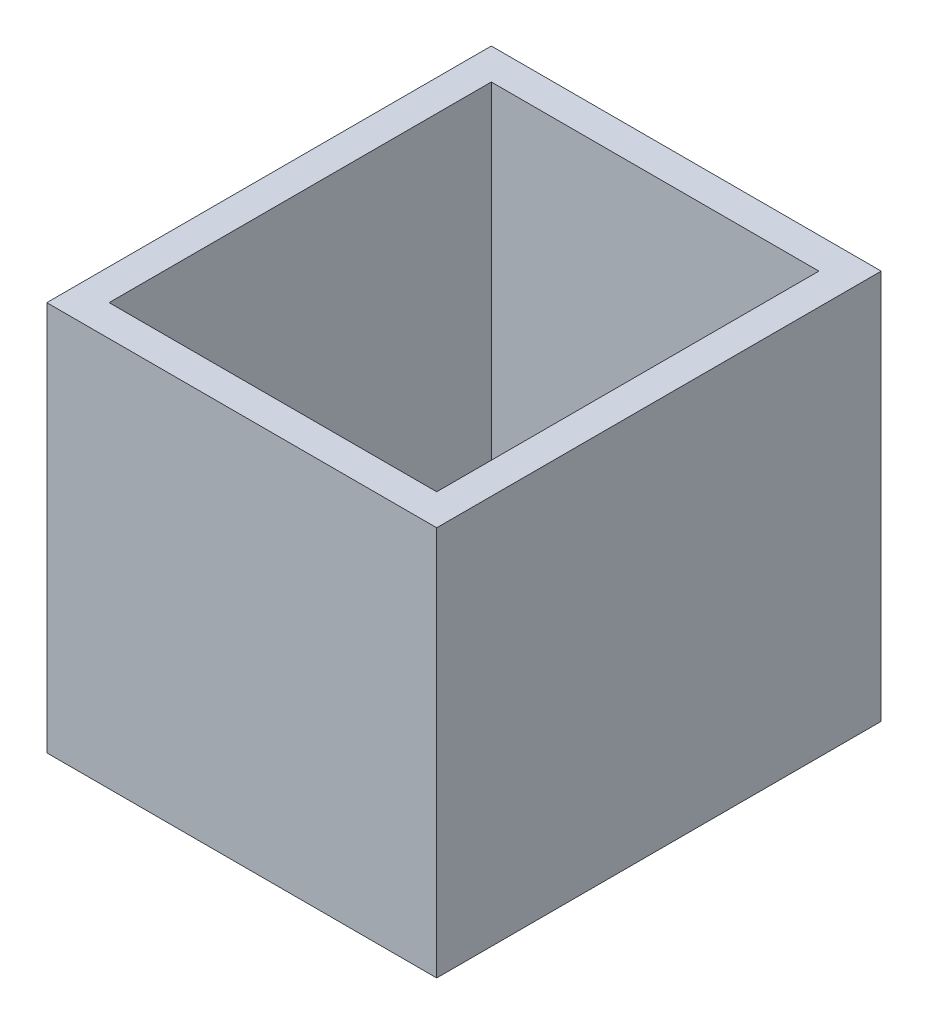
ISO-10303-21;
HEADER;
FILE_DESCRIPTION(('STEP AP214'),'2;1');
FILE_NAME('part.step','',(''),(''),'','','');
FILE_SCHEMA(('AUTOMOTIVE_DESIGN { 1 0 10303 214 1 1 1 1 }'));
ENDSEC;
DATA;
#1=APPLICATION_CONTEXT('core data for automotive mechanical design processes');
#2=APPLICATION_PROTOCOL_DEFINITION('international standard','automotive_design',2000,#1);
#3=PRODUCT_CONTEXT('',#1,'mechanical');
#4=PRODUCT('Part','Part','',(#3));
#5=PRODUCT_RELATED_PRODUCT_CATEGORY('part','',(#4));
#6=PRODUCT_DEFINITION_FORMATION('','',#4);
#7=PRODUCT_DEFINITION_CONTEXT('part definition',#1,'design');
#8=PRODUCT_DEFINITION('design','',#6,#7);
#9=PRODUCT_DEFINITION_SHAPE('','',#8);
#10=(LENGTH_UNIT() NAMED_UNIT(*) SI_UNIT(.MILLI.,.METRE.));
#11=(NAMED_UNIT(*) PLANE_ANGLE_UNIT() SI_UNIT($,.RADIAN.));
#12=(NAMED_UNIT(*) SI_UNIT($,.STERADIAN.) SOLID_ANGLE_UNIT());
#13=UNCERTAINTY_MEASURE_WITH_UNIT(LENGTH_MEASURE(1.E-05),#10,'distance_accuracy_value','');
#14=(GEOMETRIC_REPRESENTATION_CONTEXT(3) GLOBAL_UNCERTAINTY_ASSIGNED_CONTEXT((#13)) GLOBAL_UNIT_ASSIGNED_CONTEXT((#10,
#11,#12)) REPRESENTATION_CONTEXT('',''));
#15=CARTESIAN_POINT('',(0.,0.,0.));
#16=DIRECTION('',(0.,0.,1.));
#17=DIRECTION('',(1.,0.,0.));
#18=AXIS2_PLACEMENT_3D('',#15,#16,#17);
#19=CARTESIAN_POINT('',(0.,80.,0.));
#20=DIRECTION('',(0.,1.,0.));
#21=DIRECTION('',(0.,0.,1.));
#22=AXIS2_PLACEMENT_3D('',#19,#20,#21);
#23=PLANE('',#22);
#24=DIRECTION('',(-1.,0.,0.));
#25=VECTOR('',#24,1.);
#26=CARTESIAN_POINT('',(-105.,80.,-49.01));
#27=LINE('',#26,#25);
#28=CARTESIAN_POINT('',(12.01,80.,-49.01));
#29=VERTEX_POINT('',#28);
#30=CARTESIAN_POINT('',(-72.01,80.,-49.01));
#31=VERTEX_POINT('',#30);
#32=EDGE_CURVE('E49',#29,#31,#27,.T.);
#33=ORIENTED_EDGE('',*,*,#32,.T.);
#34=DIRECTION('',(0.,0.,-1.));
#35=VECTOR('',#34,1.);
#36=CARTESIAN_POINT('',(-72.01,80.,105.));
#37=LINE('',#36,#35);
#38=CARTESIAN_POINT('',(-72.01,80.,49.01));
#39=VERTEX_POINT('',#38);
#40=EDGE_CURVE('E137',#39,#31,#37,.T.);
#41=ORIENTED_EDGE('',*,*,#40,.F.);
#42=DIRECTION('',(1.,0.,0.));
#43=VECTOR('',#42,1.);
#44=CARTESIAN_POINT('',(-105.,80.,49.01));
#45=LINE('',#44,#43);
#46=CARTESIAN_POINT('',(12.01,80.,49.01));
#47=VERTEX_POINT('',#46);
#48=EDGE_CURVE('E11',#39,#47,#45,.T.);
#49=ORIENTED_EDGE('',*,*,#48,.T.);
#50=DIRECTION('',(0.,0.,-1.));
#51=VECTOR('',#50,1.);
#52=CARTESIAN_POINT('',(12.01,80.,105.));
#53=LINE('',#52,#51);
#54=EDGE_CURVE('E63',#47,#29,#53,.T.);
#55=ORIENTED_EDGE('',*,*,#54,.T.);
#56=EDGE_LOOP('',(#33,#41,#49,#55));
#57=FACE_BOUND('',#56,.T.);
#58=DIRECTION('',(0.,0.,-1.));
#59=VECTOR('',#58,1.);
#60=CARTESIAN_POINT('',(20.,80.,105.));
#61=LINE('',#60,#59);
#62=CARTESIAN_POINT('',(20.,80.,57.));
#63=VERTEX_POINT('',#62);
#64=CARTESIAN_POINT('',(20.,80.,-57.));
#65=VERTEX_POINT('',#64);
#66=EDGE_CURVE('E144',#63,#65,#61,.T.);
#67=ORIENTED_EDGE('',*,*,#66,.F.);
#68=DIRECTION('',(1.,0.,0.));
#69=VECTOR('',#68,1.);
#70=CARTESIAN_POINT('',(-105.,80.,57.));
#71=LINE('',#70,#69);
#72=CARTESIAN_POINT('',(-80.,80.,57.));
#73=VERTEX_POINT('',#72);
#74=EDGE_CURVE('E139',#73,#63,#71,.T.);
#75=ORIENTED_EDGE('',*,*,#74,.F.);
#76=DIRECTION('',(0.,0.,-1.));
#77=VECTOR('',#76,1.);
#78=CARTESIAN_POINT('',(-80.,80.,105.));
#79=LINE('',#78,#77);
#80=CARTESIAN_POINT('',(-80.,80.,-57.));
#81=VERTEX_POINT('',#80);
#82=EDGE_CURVE('E148',#73,#81,#79,.T.);
#83=ORIENTED_EDGE('',*,*,#82,.T.);
#84=DIRECTION('',(-1.,0.,0.));
#85=VECTOR('',#84,1.);
#86=CARTESIAN_POINT('',(-105.,80.,-57.));
#87=LINE('',#86,#85);
#88=EDGE_CURVE('E143',#65,#81,#87,.T.);
#89=ORIENTED_EDGE('',*,*,#88,.F.);
#90=EDGE_LOOP('',(#67,#75,#83,#89));
#91=FACE_BOUND('',#90,.T.);
#92=ADVANCED_FACE('F41',(#57,#91),#23,.F.);
#93=CARTESIAN_POINT('',(0.,180.,0.));
#94=DIRECTION('',(0.,1.,0.));
#95=DIRECTION('',(0.,0.,1.));
#96=AXIS2_PLACEMENT_3D('',#93,#94,#95);
#97=PLANE('',#96);
#98=DIRECTION('',(0.,0.,-1.));
#99=VECTOR('',#98,1.);
#100=CARTESIAN_POINT('',(20.,180.,105.));
#101=LINE('',#100,#99);
#102=CARTESIAN_POINT('',(20.,180.,57.));
#103=VERTEX_POINT('',#102);
#104=CARTESIAN_POINT('',(20.,180.,-57.));
#105=VERTEX_POINT('',#104);
#106=EDGE_CURVE('E151',#103,#105,#101,.T.);
#107=ORIENTED_EDGE('',*,*,#106,.T.);
#108=DIRECTION('',(-1.,0.,0.));
#109=VECTOR('',#108,1.);
#110=CARTESIAN_POINT('',(-105.,180.,-57.));
#111=LINE('',#110,#109);
#112=CARTESIAN_POINT('',(-80.,180.,-57.));
#113=VERTEX_POINT('',#112);
#114=EDGE_CURVE('E44',#105,#113,#111,.T.);
#115=ORIENTED_EDGE('',*,*,#114,.T.);
#116=DIRECTION('',(0.,0.,-1.));
#117=VECTOR('',#116,1.);
#118=CARTESIAN_POINT('',(-80.,180.,105.));
#119=LINE('',#118,#117);
#120=CARTESIAN_POINT('',(-80.,180.,57.));
#121=VERTEX_POINT('',#120);
#122=EDGE_CURVE('E147',#121,#113,#119,.T.);
#123=ORIENTED_EDGE('',*,*,#122,.F.);
#124=DIRECTION('',(1.,0.,0.));
#125=VECTOR('',#124,1.);
#126=CARTESIAN_POINT('',(-105.,180.,57.));
#127=LINE('',#126,#125);
#128=EDGE_CURVE('E122',#121,#103,#127,.T.);
#129=ORIENTED_EDGE('',*,*,#128,.T.);
#130=EDGE_LOOP('',(#107,#115,#123,#129));
#131=FACE_BOUND('',#130,.T.);
#132=DIRECTION('',(-1.,0.,0.));
#133=VECTOR('',#132,1.);
#134=CARTESIAN_POINT('',(-105.,180.,-49.01));
#135=LINE('',#134,#133);
#136=CARTESIAN_POINT('',(12.01,180.,-49.01));
#137=VERTEX_POINT('',#136);
#138=CARTESIAN_POINT('',(-72.01,180.,-49.01));
#139=VERTEX_POINT('',#138);
#140=EDGE_CURVE('E114',#137,#139,#135,.T.);
#141=ORIENTED_EDGE('',*,*,#140,.F.);
#142=DIRECTION('',(0.,0.,-1.));
#143=VECTOR('',#142,1.);
#144=CARTESIAN_POINT('',(12.01,180.,105.));
#145=LINE('',#144,#143);
#146=CARTESIAN_POINT('',(12.01,180.,49.01));
#147=VERTEX_POINT('',#146);
#148=EDGE_CURVE('E113',#147,#137,#145,.T.);
#149=ORIENTED_EDGE('',*,*,#148,.F.);
#150=DIRECTION('',(1.,0.,0.));
#151=VECTOR('',#150,1.);
#152=CARTESIAN_POINT('',(-105.,180.,49.01));
#153=LINE('',#152,#151);
#154=CARTESIAN_POINT('',(-72.01,180.,49.01));
#155=VERTEX_POINT('',#154);
#156=EDGE_CURVE('E107',#155,#147,#153,.T.);
#157=ORIENTED_EDGE('',*,*,#156,.F.);
#158=DIRECTION('',(0.,0.,-1.));
#159=VECTOR('',#158,1.);
#160=CARTESIAN_POINT('',(-72.01,180.,105.));
#161=LINE('',#160,#159);
#162=EDGE_CURVE('E110',#155,#139,#161,.T.);
#163=ORIENTED_EDGE('',*,*,#162,.T.);
#164=EDGE_LOOP('',(#141,#149,#157,#163));
#165=FACE_BOUND('',#164,.T.);
#166=ADVANCED_FACE('F109',(#131,#165),#97,.T.);
#167=CARTESIAN_POINT('',(-72.01,0.,105.));
#168=DIRECTION('',(-1.,0.,0.));
#169=DIRECTION('',(0.,0.,1.));
#170=AXIS2_PLACEMENT_3D('',#167,#168,#169);
#171=PLANE('',#170);
#172=ORIENTED_EDGE('',*,*,#162,.F.);
#173=DIRECTION('',(0.,-1.,0.));
#174=VECTOR('',#173,1.);
#175=CARTESIAN_POINT('',(-72.01,0.,49.01));
#176=LINE('',#175,#174);
#177=EDGE_CURVE('E115',#155,#39,#176,.T.);
#178=ORIENTED_EDGE('',*,*,#177,.T.);
#179=ORIENTED_EDGE('',*,*,#40,.T.);
#180=DIRECTION('',(0.,1.,0.));
#181=VECTOR('',#180,1.);
#182=CARTESIAN_POINT('',(-72.01,0.,-49.01));
#183=LINE('',#182,#181);
#184=EDGE_CURVE('E121',#31,#139,#183,.T.);
#185=ORIENTED_EDGE('',*,*,#184,.T.);
#186=EDGE_LOOP('',(#172,#178,#179,#185));
#187=FACE_BOUND('',#186,.T.);
#188=ADVANCED_FACE('F119',(#187),#171,.F.);
#189=CARTESIAN_POINT('',(12.01,0.,105.));
#190=DIRECTION('',(-1.,0.,0.));
#191=DIRECTION('',(0.,0.,1.));
#192=AXIS2_PLACEMENT_3D('',#189,#190,#191);
#193=PLANE('',#192);
#194=DIRECTION('',(0.,-1.,0.));
#195=VECTOR('',#194,1.);
#196=CARTESIAN_POINT('',(12.01,0.,49.01));
#197=LINE('',#196,#195);
#198=EDGE_CURVE('E134',#147,#47,#197,.T.);
#199=ORIENTED_EDGE('',*,*,#198,.F.);
#200=ORIENTED_EDGE('',*,*,#148,.T.);
#201=DIRECTION('',(0.,1.,0.));
#202=VECTOR('',#201,1.);
#203=CARTESIAN_POINT('',(12.01,0.,-49.01));
#204=LINE('',#203,#202);
#205=EDGE_CURVE('E126',#29,#137,#204,.T.);
#206=ORIENTED_EDGE('',*,*,#205,.F.);
#207=ORIENTED_EDGE('',*,*,#54,.F.);
#208=EDGE_LOOP('',(#199,#200,#206,#207));
#209=FACE_BOUND('',#208,.T.);
#210=ADVANCED_FACE('F193',(#209),#193,.T.);
#211=CARTESIAN_POINT('',(-105.,207.,-49.01));
#212=DIRECTION('',(0.,0.,1.));
#213=DIRECTION('',(0.,-1.,0.));
#214=AXIS2_PLACEMENT_3D('',#211,#212,#213);
#215=PLANE('',#214);
#216=ORIENTED_EDGE('',*,*,#205,.T.);
#217=ORIENTED_EDGE('',*,*,#140,.T.);
#218=ORIENTED_EDGE('',*,*,#184,.F.);
#219=ORIENTED_EDGE('',*,*,#32,.F.);
#220=EDGE_LOOP('',(#216,#217,#218,#219));
#221=FACE_BOUND('',#220,.T.);
#222=ADVANCED_FACE('F192',(#221),#215,.T.);
#223=CARTESIAN_POINT('',(-105.,207.,49.01));
#224=DIRECTION('',(0.,0.,-1.));
#225=DIRECTION('',(0.,1.,0.));
#226=AXIS2_PLACEMENT_3D('',#223,#224,#225);
#227=PLANE('',#226);
#228=ORIENTED_EDGE('',*,*,#177,.F.);
#229=ORIENTED_EDGE('',*,*,#156,.T.);
#230=ORIENTED_EDGE('',*,*,#198,.T.);
#231=ORIENTED_EDGE('',*,*,#48,.F.);
#232=EDGE_LOOP('',(#228,#229,#230,#231));
#233=FACE_BOUND('',#232,.T.);
#234=ADVANCED_FACE('F124',(#233),#227,.T.);
#235=CARTESIAN_POINT('',(20.,0.,105.));
#236=DIRECTION('',(-1.,0.,0.));
#237=DIRECTION('',(0.,0.,1.));
#238=AXIS2_PLACEMENT_3D('',#235,#236,#237);
#239=PLANE('',#238);
#240=ORIENTED_EDGE('',*,*,#106,.F.);
#241=DIRECTION('',(0.,-1.,0.));
#242=VECTOR('',#241,1.);
#243=CARTESIAN_POINT('',(20.,0.,57.));
#244=LINE('',#243,#242);
#245=EDGE_CURVE('E129',#103,#63,#244,.T.);
#246=ORIENTED_EDGE('',*,*,#245,.T.);
#247=ORIENTED_EDGE('',*,*,#66,.T.);
#248=DIRECTION('',(0.,1.,0.));
#249=VECTOR('',#248,1.);
#250=CARTESIAN_POINT('',(20.,0.,-57.));
#251=LINE('',#250,#249);
#252=EDGE_CURVE('E174',#65,#105,#251,.T.);
#253=ORIENTED_EDGE('',*,*,#252,.T.);
#254=EDGE_LOOP('',(#240,#246,#247,#253));
#255=FACE_BOUND('',#254,.T.);
#256=ADVANCED_FACE('F179',(#255),#239,.F.);
#257=CARTESIAN_POINT('',(-80.,0.,105.));
#258=DIRECTION('',(-1.,0.,0.));
#259=DIRECTION('',(0.,0.,1.));
#260=AXIS2_PLACEMENT_3D('',#257,#258,#259);
#261=PLANE('',#260);
#262=DIRECTION('',(0.,-1.,0.));
#263=VECTOR('',#262,1.);
#264=CARTESIAN_POINT('',(-80.,0.,57.));
#265=LINE('',#264,#263);
#266=EDGE_CURVE('E166',#121,#73,#265,.T.);
#267=ORIENTED_EDGE('',*,*,#266,.F.);
#268=ORIENTED_EDGE('',*,*,#122,.T.);
#269=DIRECTION('',(0.,1.,0.));
#270=VECTOR('',#269,1.);
#271=CARTESIAN_POINT('',(-80.,0.,-57.));
#272=LINE('',#271,#270);
#273=EDGE_CURVE('E164',#81,#113,#272,.T.);
#274=ORIENTED_EDGE('',*,*,#273,.F.);
#275=ORIENTED_EDGE('',*,*,#82,.F.);
#276=EDGE_LOOP('',(#267,#268,#274,#275));
#277=FACE_BOUND('',#276,.T.);
#278=ADVANCED_FACE('F163',(#277),#261,.T.);
#279=CARTESIAN_POINT('',(-105.,207.,57.));
#280=DIRECTION('',(0.,0.,-1.));
#281=DIRECTION('',(0.,1.,0.));
#282=AXIS2_PLACEMENT_3D('',#279,#280,#281);
#283=PLANE('',#282);
#284=ORIENTED_EDGE('',*,*,#128,.F.);
#285=ORIENTED_EDGE('',*,*,#266,.T.);
#286=ORIENTED_EDGE('',*,*,#74,.T.);
#287=ORIENTED_EDGE('',*,*,#245,.F.);
#288=EDGE_LOOP('',(#284,#285,#286,#287));
#289=FACE_BOUND('',#288,.T.);
#290=ADVANCED_FACE('F182',(#289),#283,.F.);
#291=CARTESIAN_POINT('',(-105.,207.,-57.));
#292=DIRECTION('',(0.,0.,1.));
#293=DIRECTION('',(0.,-1.,0.));
#294=AXIS2_PLACEMENT_3D('',#291,#292,#293);
#295=PLANE('',#294);
#296=ORIENTED_EDGE('',*,*,#114,.F.);
#297=ORIENTED_EDGE('',*,*,#252,.F.);
#298=ORIENTED_EDGE('',*,*,#88,.T.);
#299=ORIENTED_EDGE('',*,*,#273,.T.);
#300=EDGE_LOOP('',(#296,#297,#298,#299));
#301=FACE_BOUND('',#300,.T.);
#302=ADVANCED_FACE('F173',(#301),#295,.F.);
#303=CLOSED_SHELL('',(#92,#166,#188,#210,#222,#234,#256,#278,#290,#302));
#304=MANIFOLD_SOLID_BREP('B2',#303);
#305=ADVANCED_BREP_SHAPE_REPRESENTATION('',(#18,#304),#14);
#306=SHAPE_DEFINITION_REPRESENTATION(#9,#305);
ENDSEC;
END-ISO-10303-21;
